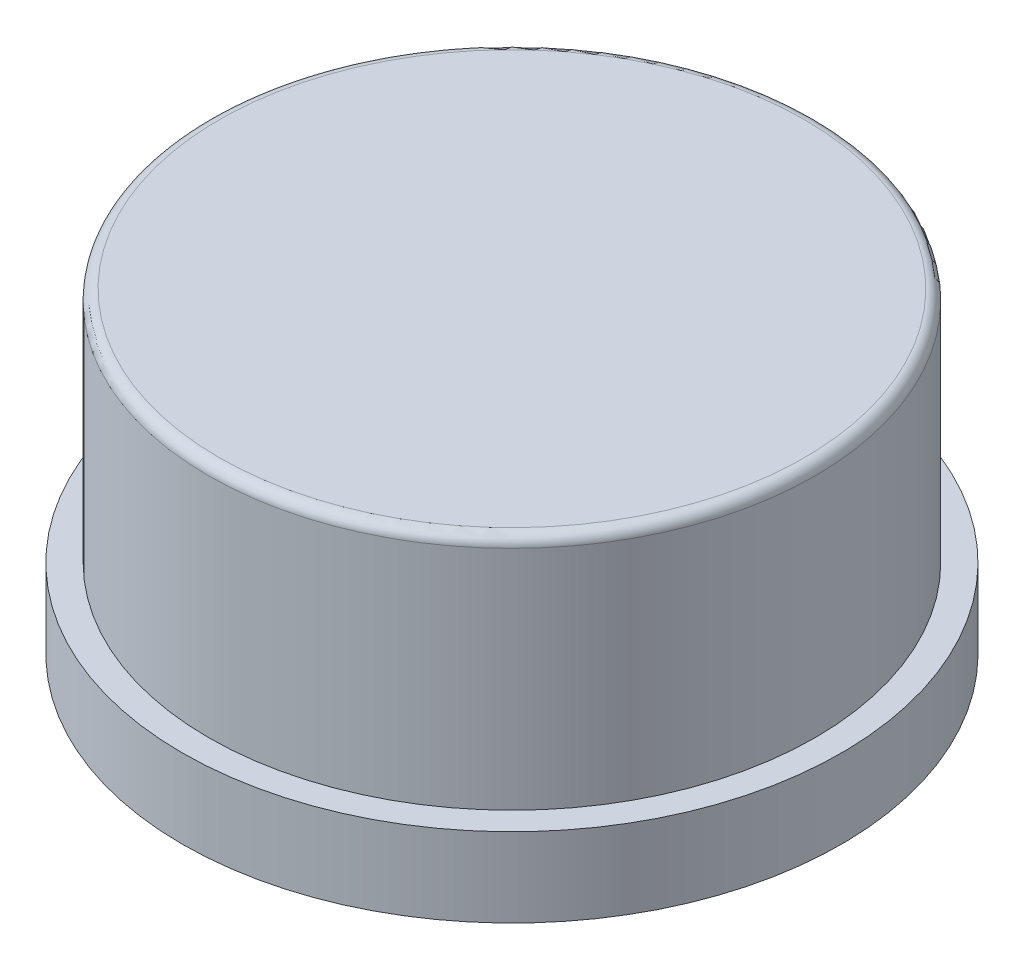
ISO-10303-21;
HEADER;
FILE_DESCRIPTION(('STEP AP214'),'2;1');
FILE_NAME('part.step','',(''),(''),'','','');
FILE_SCHEMA(('AUTOMOTIVE_DESIGN { 1 0 10303 214 1 1 1 1 }'));
ENDSEC;
DATA;
#1=APPLICATION_CONTEXT('core data for automotive mechanical design processes');
#2=APPLICATION_PROTOCOL_DEFINITION('international standard','automotive_design',2000,#1);
#3=PRODUCT_CONTEXT('',#1,'mechanical');
#4=PRODUCT('Part','Part','',(#3));
#5=PRODUCT_RELATED_PRODUCT_CATEGORY('part','',(#4));
#6=PRODUCT_DEFINITION_FORMATION('','',#4);
#7=PRODUCT_DEFINITION_CONTEXT('part definition',#1,'design');
#8=PRODUCT_DEFINITION('design','',#6,#7);
#9=PRODUCT_DEFINITION_SHAPE('','',#8);
#10=(LENGTH_UNIT() NAMED_UNIT(*) SI_UNIT(.MILLI.,.METRE.));
#11=(NAMED_UNIT(*) PLANE_ANGLE_UNIT() SI_UNIT($,.RADIAN.));
#12=(NAMED_UNIT(*) SI_UNIT($,.STERADIAN.) SOLID_ANGLE_UNIT());
#13=UNCERTAINTY_MEASURE_WITH_UNIT(LENGTH_MEASURE(1.E-05),#10,'distance_accuracy_value','');
#14=(GEOMETRIC_REPRESENTATION_CONTEXT(3) GLOBAL_UNCERTAINTY_ASSIGNED_CONTEXT((#13)) GLOBAL_UNIT_ASSIGNED_CONTEXT((#10,
#11,#12)) REPRESENTATION_CONTEXT('',''));
#15=CARTESIAN_POINT('',(0.,0.,0.));
#16=DIRECTION('',(0.,0.,1.));
#17=DIRECTION('',(1.,0.,0.));
#18=AXIS2_PLACEMENT_3D('',#15,#16,#17);
#19=CARTESIAN_POINT('',(0.,0.,0.));
#20=DIRECTION('',(0.,1.,0.));
#21=DIRECTION('',(0.,0.,1.));
#22=AXIS2_PLACEMENT_3D('',#19,#20,#21);
#23=PLANE('',#22);
#24=CARTESIAN_POINT('',(0.,0.,0.));
#25=DIRECTION('',(0.,1.,0.));
#26=DIRECTION('',(0.,0.,1.));
#27=AXIS2_PLACEMENT_3D('',#24,#25,#26);
#28=CIRCLE('',#27,6.25);
#29=CARTESIAN_POINT('',(0.,0.,6.25));
#30=VERTEX_POINT('',#29);
#31=EDGE_CURVE('E181',#30,#30,#28,.T.);
#32=ORIENTED_EDGE('',*,*,#31,.F.);
#33=EDGE_LOOP('',(#32));
#34=FACE_BOUND('',#33,.T.);
#35=DIRECTION('',(0.,0.,1.));
#36=VECTOR('',#35,1.);
#37=CARTESIAN_POINT('',(2.5,0.,-2.5));
#38=LINE('',#37,#36);
#39=CARTESIAN_POINT('',(2.5,0.,-2.5));
#40=VERTEX_POINT('',#39);
#41=CARTESIAN_POINT('',(2.5,0.,2.5));
#42=VERTEX_POINT('',#41);
#43=EDGE_CURVE('E142',#40,#42,#38,.T.);
#44=ORIENTED_EDGE('',*,*,#43,.F.);
#45=DIRECTION('',(-1.,0.,0.));
#46=VECTOR('',#45,1.);
#47=CARTESIAN_POINT('',(2.5,0.,-2.5));
#48=LINE('',#47,#46);
#49=CARTESIAN_POINT('',(-2.5,0.,-2.5));
#50=VERTEX_POINT('',#49);
#51=EDGE_CURVE('E154',#40,#50,#48,.T.);
#52=ORIENTED_EDGE('',*,*,#51,.T.);
#53=DIRECTION('',(0.,0.,1.));
#54=VECTOR('',#53,1.);
#55=CARTESIAN_POINT('',(-2.5,0.,-2.5));
#56=LINE('',#55,#54);
#57=CARTESIAN_POINT('',(-2.5,0.,2.5));
#58=VERTEX_POINT('',#57);
#59=EDGE_CURVE('E59',#50,#58,#56,.T.);
#60=ORIENTED_EDGE('',*,*,#59,.T.);
#61=DIRECTION('',(-1.,0.,0.));
#62=VECTOR('',#61,1.);
#63=CARTESIAN_POINT('',(2.5,0.,2.5));
#64=LINE('',#63,#62);
#65=EDGE_CURVE('E165',#42,#58,#64,.T.);
#66=ORIENTED_EDGE('',*,*,#65,.F.);
#67=EDGE_LOOP('',(#44,#52,#60,#66));
#68=FACE_BOUND('',#67,.T.);
#69=ADVANCED_FACE('F36',(#34,#68),#23,.F.);
#70=CARTESIAN_POINT('',(0.,1.5,0.));
#71=DIRECTION('',(0.,-1.,0.));
#72=DIRECTION('',(0.,0.,-1.));
#73=AXIS2_PLACEMENT_3D('',#70,#71,#72);
#74=CYLINDRICAL_SURFACE('',#73,6.25);
#75=CARTESIAN_POINT('',(0.,1.5,0.));
#76=DIRECTION('',(0.,1.,0.));
#77=DIRECTION('',(0.,0.,1.));
#78=AXIS2_PLACEMENT_3D('',#75,#76,#77);
#79=CIRCLE('',#78,6.25);
#80=CARTESIAN_POINT('',(0.,1.5,6.25));
#81=VERTEX_POINT('',#80);
#82=EDGE_CURVE('E182',#81,#81,#79,.T.);
#83=ORIENTED_EDGE('',*,*,#82,.F.);
#84=EDGE_LOOP('',(#83));
#85=FACE_BOUND('',#84,.T.);
#86=ORIENTED_EDGE('',*,*,#31,.T.);
#87=EDGE_LOOP('',(#86));
#88=FACE_BOUND('',#87,.T.);
#89=ADVANCED_FACE('F205',(#85,#88),#74,.T.);
#90=CARTESIAN_POINT('',(0.,1.5,0.));
#91=DIRECTION('',(0.,1.,0.));
#92=DIRECTION('',(0.,0.,1.));
#93=AXIS2_PLACEMENT_3D('',#90,#91,#92);
#94=PLANE('',#93);
#95=CARTESIAN_POINT('',(0.,1.5,0.));
#96=DIRECTION('',(0.,1.,0.));
#97=DIRECTION('',(0.,0.,1.));
#98=AXIS2_PLACEMENT_3D('',#95,#96,#97);
#99=CIRCLE('',#98,5.75);
#100=CARTESIAN_POINT('',(0.,1.5,5.75));
#101=VERTEX_POINT('',#100);
#102=EDGE_CURVE('E178',#101,#101,#99,.T.);
#103=ORIENTED_EDGE('',*,*,#102,.F.);
#104=EDGE_LOOP('',(#103));
#105=FACE_BOUND('',#104,.T.);
#106=ORIENTED_EDGE('',*,*,#82,.T.);
#107=EDGE_LOOP('',(#106));
#108=FACE_BOUND('',#107,.T.);
#109=ADVANCED_FACE('F211',(#105,#108),#94,.T.);
#110=CARTESIAN_POINT('',(0.,6.,0.));
#111=DIRECTION('',(0.,-1.,0.));
#112=DIRECTION('',(0.,0.,-1.));
#113=AXIS2_PLACEMENT_3D('',#110,#111,#112);
#114=CYLINDRICAL_SURFACE('',#113,5.75);
#115=CARTESIAN_POINT('',(0.,5.8,0.));
#116=DIRECTION('',(0.,1.,0.));
#117=DIRECTION('',(0.,0.,1.));
#118=AXIS2_PLACEMENT_3D('',#115,#116,#117);
#119=CIRCLE('',#118,5.75);
#120=CARTESIAN_POINT('',(0.,5.8,5.75));
#121=VERTEX_POINT('',#120);
#122=EDGE_CURVE('E11',#121,#121,#119,.F.);
#123=ORIENTED_EDGE('',*,*,#122,.T.);
#124=EDGE_LOOP('',(#123));
#125=FACE_BOUND('',#124,.T.);
#126=ORIENTED_EDGE('',*,*,#102,.T.);
#127=EDGE_LOOP('',(#126));
#128=FACE_BOUND('',#127,.T.);
#129=ADVANCED_FACE('F201',(#125,#128),#114,.T.);
#130=CARTESIAN_POINT('',(0.,6.,0.));
#131=DIRECTION('',(0.,1.,0.));
#132=DIRECTION('',(0.,0.,1.));
#133=AXIS2_PLACEMENT_3D('',#130,#131,#132);
#134=PLANE('',#133);
#135=CARTESIAN_POINT('',(0.,6.,0.));
#136=DIRECTION('',(0.,1.,0.));
#137=DIRECTION('',(0.,0.,1.));
#138=AXIS2_PLACEMENT_3D('',#135,#136,#137);
#139=CIRCLE('',#138,5.55);
#140=CARTESIAN_POINT('',(0.,6.,5.55));
#141=VERTEX_POINT('',#140);
#142=EDGE_CURVE('E44',#141,#141,#139,.T.);
#143=ORIENTED_EDGE('',*,*,#142,.T.);
#144=EDGE_LOOP('',(#143));
#145=FACE_BOUND('',#144,.T.);
#146=ADVANCED_FACE('F189',(#145),#134,.T.);
#147=CARTESIAN_POINT('',(0.,5.8,0.));
#148=DIRECTION('',(0.,1.,0.));
#149=DIRECTION('',(0.,0.,1.));
#150=AXIS2_PLACEMENT_3D('',#147,#148,#149);
#151=TOROIDAL_SURFACE('',#150,5.55,0.2);
#152=ORIENTED_EDGE('',*,*,#122,.F.);
#153=EDGE_LOOP('',(#152));
#154=FACE_BOUND('',#153,.T.);
#155=ORIENTED_EDGE('',*,*,#142,.F.);
#156=EDGE_LOOP('',(#155));
#157=FACE_BOUND('',#156,.T.);
#158=ADVANCED_FACE('F38',(#154,#157),#151,.T.);
#159=CARTESIAN_POINT('',(2.5,-0.1,-2.5));
#160=DIRECTION('',(-1.,0.,0.));
#161=DIRECTION('',(0.,0.,1.));
#162=AXIS2_PLACEMENT_3D('',#159,#160,#161);
#163=PLANE('',#162);
#164=ORIENTED_EDGE('',*,*,#43,.T.);
#165=DIRECTION('',(0.,1.,0.));
#166=VECTOR('',#165,1.);
#167=CARTESIAN_POINT('',(2.5,-0.1,2.5));
#168=LINE('',#167,#166);
#169=CARTESIAN_POINT('',(2.5,-0.1,2.5));
#170=VERTEX_POINT('',#169);
#171=EDGE_CURVE('E176',#170,#42,#168,.T.);
#172=ORIENTED_EDGE('',*,*,#171,.F.);
#173=DIRECTION('',(0.,0.,1.));
#174=VECTOR('',#173,1.);
#175=CARTESIAN_POINT('',(2.5,-0.1,-2.5));
#176=LINE('',#175,#174);
#177=CARTESIAN_POINT('',(2.5,-0.1,-2.5));
#178=VERTEX_POINT('',#177);
#179=EDGE_CURVE('E150',#178,#170,#176,.T.);
#180=ORIENTED_EDGE('',*,*,#179,.F.);
#181=DIRECTION('',(0.,1.,0.));
#182=VECTOR('',#181,1.);
#183=CARTESIAN_POINT('',(2.5,-0.1,-2.5));
#184=LINE('',#183,#182);
#185=EDGE_CURVE('E162',#178,#40,#184,.T.);
#186=ORIENTED_EDGE('',*,*,#185,.T.);
#187=EDGE_LOOP('',(#164,#172,#180,#186));
#188=FACE_BOUND('',#187,.T.);
#189=ADVANCED_FACE('F192',(#188),#163,.F.);
#190=CARTESIAN_POINT('',(2.5,-0.1,2.5));
#191=DIRECTION('',(0.,0.,-1.));
#192=DIRECTION('',(-1.,0.,0.));
#193=AXIS2_PLACEMENT_3D('',#190,#191,#192);
#194=PLANE('',#193);
#195=ORIENTED_EDGE('',*,*,#65,.T.);
#196=DIRECTION('',(0.,1.,0.));
#197=VECTOR('',#196,1.);
#198=CARTESIAN_POINT('',(-2.5,-0.1,2.5));
#199=LINE('',#198,#197);
#200=CARTESIAN_POINT('',(-2.5,-0.1,2.5));
#201=VERTEX_POINT('',#200);
#202=EDGE_CURVE('E174',#201,#58,#199,.T.);
#203=ORIENTED_EDGE('',*,*,#202,.F.);
#204=DIRECTION('',(-1.,0.,0.));
#205=VECTOR('',#204,1.);
#206=CARTESIAN_POINT('',(2.5,-0.1,2.5));
#207=LINE('',#206,#205);
#208=EDGE_CURVE('E153',#170,#201,#207,.T.);
#209=ORIENTED_EDGE('',*,*,#208,.F.);
#210=ORIENTED_EDGE('',*,*,#171,.T.);
#211=EDGE_LOOP('',(#195,#203,#209,#210));
#212=FACE_BOUND('',#211,.T.);
#213=ADVANCED_FACE('F198',(#212),#194,.F.);
#214=CARTESIAN_POINT('',(-2.5,-0.1,-2.5));
#215=DIRECTION('',(-1.,0.,0.));
#216=DIRECTION('',(0.,0.,1.));
#217=AXIS2_PLACEMENT_3D('',#214,#215,#216);
#218=PLANE('',#217);
#219=ORIENTED_EDGE('',*,*,#59,.F.);
#220=DIRECTION('',(0.,1.,0.));
#221=VECTOR('',#220,1.);
#222=CARTESIAN_POINT('',(-2.5,-0.1,-2.5));
#223=LINE('',#222,#221);
#224=CARTESIAN_POINT('',(-2.5,-0.1,-2.5));
#225=VERTEX_POINT('',#224);
#226=EDGE_CURVE('E172',#225,#50,#223,.T.);
#227=ORIENTED_EDGE('',*,*,#226,.F.);
#228=DIRECTION('',(0.,0.,1.));
#229=VECTOR('',#228,1.);
#230=CARTESIAN_POINT('',(-2.5,-0.1,-2.5));
#231=LINE('',#230,#229);
#232=EDGE_CURVE('E156',#225,#201,#231,.T.);
#233=ORIENTED_EDGE('',*,*,#232,.T.);
#234=ORIENTED_EDGE('',*,*,#202,.T.);
#235=EDGE_LOOP('',(#219,#227,#233,#234));
#236=FACE_BOUND('',#235,.T.);
#237=ADVANCED_FACE('F224',(#236),#218,.T.);
#238=CARTESIAN_POINT('',(2.5,-0.1,-2.5));
#239=DIRECTION('',(0.,0.,-1.));
#240=DIRECTION('',(-1.,0.,0.));
#241=AXIS2_PLACEMENT_3D('',#238,#239,#240);
#242=PLANE('',#241);
#243=ORIENTED_EDGE('',*,*,#51,.F.);
#244=ORIENTED_EDGE('',*,*,#185,.F.);
#245=DIRECTION('',(-1.,0.,0.));
#246=VECTOR('',#245,1.);
#247=CARTESIAN_POINT('',(2.5,-0.1,-2.5));
#248=LINE('',#247,#246);
#249=EDGE_CURVE('E159',#178,#225,#248,.T.);
#250=ORIENTED_EDGE('',*,*,#249,.T.);
#251=ORIENTED_EDGE('',*,*,#226,.T.);
#252=EDGE_LOOP('',(#243,#244,#250,#251));
#253=FACE_BOUND('',#252,.T.);
#254=ADVANCED_FACE('F228',(#253),#242,.T.);
#255=CARTESIAN_POINT('',(0.,-0.1,0.));
#256=DIRECTION('',(0.,-1.,0.));
#257=DIRECTION('',(0.,0.,-1.));
#258=AXIS2_PLACEMENT_3D('',#255,#256,#257);
#259=PLANE('',#258);
#260=DIRECTION('',(0.,0.,1.));
#261=VECTOR('',#260,1.);
#262=CARTESIAN_POINT('',(1.9,-0.1,-2.5));
#263=LINE('',#262,#261);
#264=CARTESIAN_POINT('',(1.9,-0.1,-1.9));
#265=VERTEX_POINT('',#264);
#266=CARTESIAN_POINT('',(1.9,-0.1,1.9));
#267=VERTEX_POINT('',#266);
#268=EDGE_CURVE('E122',#265,#267,#263,.T.);
#269=ORIENTED_EDGE('',*,*,#268,.F.);
#270=DIRECTION('',(-1.,0.,0.));
#271=VECTOR('',#270,1.);
#272=CARTESIAN_POINT('',(2.5,-0.1,-1.9));
#273=LINE('',#272,#271);
#274=CARTESIAN_POINT('',(-1.9,-0.1,-1.9));
#275=VERTEX_POINT('',#274);
#276=EDGE_CURVE('E145',#265,#275,#273,.T.);
#277=ORIENTED_EDGE('',*,*,#276,.T.);
#278=DIRECTION('',(0.,0.,1.));
#279=VECTOR('',#278,1.);
#280=CARTESIAN_POINT('',(-1.9,-0.1,-2.5));
#281=LINE('',#280,#279);
#282=CARTESIAN_POINT('',(-1.9,-0.1,1.9));
#283=VERTEX_POINT('',#282);
#284=EDGE_CURVE('E51',#275,#283,#281,.T.);
#285=ORIENTED_EDGE('',*,*,#284,.T.);
#286=DIRECTION('',(-1.,0.,0.));
#287=VECTOR('',#286,1.);
#288=CARTESIAN_POINT('',(2.5,-0.1,1.9));
#289=LINE('',#288,#287);
#290=EDGE_CURVE('E124',#267,#283,#289,.T.);
#291=ORIENTED_EDGE('',*,*,#290,.F.);
#292=EDGE_LOOP('',(#269,#277,#285,#291));
#293=FACE_BOUND('',#292,.T.);
#294=ORIENTED_EDGE('',*,*,#179,.T.);
#295=ORIENTED_EDGE('',*,*,#208,.T.);
#296=ORIENTED_EDGE('',*,*,#232,.F.);
#297=ORIENTED_EDGE('',*,*,#249,.F.);
#298=EDGE_LOOP('',(#294,#295,#296,#297));
#299=FACE_BOUND('',#298,.T.);
#300=ADVANCED_FACE('F231',(#293,#299),#259,.T.);
#301=CARTESIAN_POINT('',(0.,0.6,0.));
#302=DIRECTION('',(0.,1.,0.));
#303=DIRECTION('',(0.,0.,1.));
#304=AXIS2_PLACEMENT_3D('',#301,#302,#303);
#305=PLANE('',#304);
#306=CARTESIAN_POINT('',(0.,0.6,0.));
#307=DIRECTION('',(0.,1.,0.));
#308=DIRECTION('',(0.,0.,1.));
#309=AXIS2_PLACEMENT_3D('',#306,#307,#308);
#310=CIRCLE('',#309,5.65);
#311=CARTESIAN_POINT('',(0.,0.6,5.65));
#312=VERTEX_POINT('',#311);
#313=EDGE_CURVE('E135',#312,#312,#310,.T.);
#314=ORIENTED_EDGE('',*,*,#313,.T.);
#315=EDGE_LOOP('',(#314));
#316=FACE_BOUND('',#315,.T.);
#317=DIRECTION('',(0.,0.,1.));
#318=VECTOR('',#317,1.);
#319=CARTESIAN_POINT('',(1.9,0.6,0.));
#320=LINE('',#319,#318);
#321=CARTESIAN_POINT('',(1.9,0.6,-1.9));
#322=VERTEX_POINT('',#321);
#323=CARTESIAN_POINT('',(1.9,0.6,1.9));
#324=VERTEX_POINT('',#323);
#325=EDGE_CURVE('E127',#322,#324,#320,.T.);
#326=ORIENTED_EDGE('',*,*,#325,.T.);
#327=DIRECTION('',(-1.,0.,0.));
#328=VECTOR('',#327,1.);
#329=CARTESIAN_POINT('',(0.,0.6,1.9));
#330=LINE('',#329,#328);
#331=CARTESIAN_POINT('',(-1.9,0.6,1.9));
#332=VERTEX_POINT('',#331);
#333=EDGE_CURVE('E111',#324,#332,#330,.T.);
#334=ORIENTED_EDGE('',*,*,#333,.T.);
#335=DIRECTION('',(0.,0.,1.));
#336=VECTOR('',#335,1.);
#337=CARTESIAN_POINT('',(-1.9,0.6,0.));
#338=LINE('',#337,#336);
#339=CARTESIAN_POINT('',(-1.9,0.6,-1.9));
#340=VERTEX_POINT('',#339);
#341=EDGE_CURVE('E104',#340,#332,#338,.T.);
#342=ORIENTED_EDGE('',*,*,#341,.F.);
#343=DIRECTION('',(-1.,0.,0.));
#344=VECTOR('',#343,1.);
#345=CARTESIAN_POINT('',(0.,0.6,-1.9));
#346=LINE('',#345,#344);
#347=EDGE_CURVE('E108',#322,#340,#346,.T.);
#348=ORIENTED_EDGE('',*,*,#347,.F.);
#349=EDGE_LOOP('',(#326,#334,#342,#348));
#350=FACE_BOUND('',#349,.T.);
#351=ADVANCED_FACE('F106',(#316,#350),#305,.T.);
#352=CARTESIAN_POINT('',(0.,1.5,0.));
#353=DIRECTION('',(0.,-1.,0.));
#354=DIRECTION('',(0.,0.,-1.));
#355=AXIS2_PLACEMENT_3D('',#352,#353,#354);
#356=CYLINDRICAL_SURFACE('',#355,5.65);
#357=CARTESIAN_POINT('',(0.,0.9,0.));
#358=DIRECTION('',(0.,1.,0.));
#359=DIRECTION('',(0.,0.,1.));
#360=AXIS2_PLACEMENT_3D('',#357,#358,#359);
#361=CIRCLE('',#360,5.65);
#362=CARTESIAN_POINT('',(0.,0.9,5.65));
#363=VERTEX_POINT('',#362);
#364=EDGE_CURVE('E131',#363,#363,#361,.T.);
#365=ORIENTED_EDGE('',*,*,#364,.T.);
#366=EDGE_LOOP('',(#365));
#367=FACE_BOUND('',#366,.T.);
#368=ORIENTED_EDGE('',*,*,#313,.F.);
#369=EDGE_LOOP('',(#368));
#370=FACE_BOUND('',#369,.T.);
#371=ADVANCED_FACE('F259',(#367,#370),#356,.F.);
#372=CARTESIAN_POINT('',(0.,0.9,0.));
#373=DIRECTION('',(0.,1.,0.));
#374=DIRECTION('',(0.,0.,1.));
#375=AXIS2_PLACEMENT_3D('',#372,#373,#374);
#376=PLANE('',#375);
#377=CARTESIAN_POINT('',(0.,0.9,0.));
#378=DIRECTION('',(0.,1.,0.));
#379=DIRECTION('',(0.,0.,1.));
#380=AXIS2_PLACEMENT_3D('',#377,#378,#379);
#381=CIRCLE('',#380,5.15);
#382=CARTESIAN_POINT('',(0.,0.9,5.15));
#383=VERTEX_POINT('',#382);
#384=EDGE_CURVE('E136',#383,#383,#381,.T.);
#385=ORIENTED_EDGE('',*,*,#384,.T.);
#386=EDGE_LOOP('',(#385));
#387=FACE_BOUND('',#386,.T.);
#388=ORIENTED_EDGE('',*,*,#364,.F.);
#389=EDGE_LOOP('',(#388));
#390=FACE_BOUND('',#389,.T.);
#391=ADVANCED_FACE('F255',(#387,#390),#376,.F.);
#392=CARTESIAN_POINT('',(0.,6.,0.));
#393=DIRECTION('',(0.,-1.,0.));
#394=DIRECTION('',(0.,0.,-1.));
#395=AXIS2_PLACEMENT_3D('',#392,#393,#394);
#396=CYLINDRICAL_SURFACE('',#395,5.15);
#397=CARTESIAN_POINT('',(0.,5.4,0.));
#398=DIRECTION('',(0.,1.,0.));
#399=DIRECTION('',(0.,0.,1.));
#400=AXIS2_PLACEMENT_3D('',#397,#398,#399);
#401=CIRCLE('',#400,5.15);
#402=CARTESIAN_POINT('',(0.,5.4,5.15));
#403=VERTEX_POINT('',#402);
#404=EDGE_CURVE('E134',#403,#403,#401,.T.);
#405=ORIENTED_EDGE('',*,*,#404,.T.);
#406=EDGE_LOOP('',(#405));
#407=FACE_BOUND('',#406,.T.);
#408=ORIENTED_EDGE('',*,*,#384,.F.);
#409=EDGE_LOOP('',(#408));
#410=FACE_BOUND('',#409,.T.);
#411=ADVANCED_FACE('F251',(#407,#410),#396,.F.);
#412=CARTESIAN_POINT('',(0.,5.4,0.));
#413=DIRECTION('',(0.,1.,0.));
#414=DIRECTION('',(0.,0.,1.));
#415=AXIS2_PLACEMENT_3D('',#412,#413,#414);
#416=PLANE('',#415);
#417=ORIENTED_EDGE('',*,*,#404,.F.);
#418=EDGE_LOOP('',(#417));
#419=FACE_BOUND('',#418,.T.);
#420=ADVANCED_FACE('F247',(#419),#416,.F.);
#421=CARTESIAN_POINT('',(1.9,-0.1,-2.5));
#422=DIRECTION('',(-1.,0.,0.));
#423=DIRECTION('',(0.,0.,1.));
#424=AXIS2_PLACEMENT_3D('',#421,#422,#423);
#425=PLANE('',#424);
#426=ORIENTED_EDGE('',*,*,#325,.F.);
#427=DIRECTION('',(0.,1.,0.));
#428=VECTOR('',#427,1.);
#429=CARTESIAN_POINT('',(1.9,-0.1,-1.9));
#430=LINE('',#429,#428);
#431=EDGE_CURVE('E119',#265,#322,#430,.T.);
#432=ORIENTED_EDGE('',*,*,#431,.F.);
#433=ORIENTED_EDGE('',*,*,#268,.T.);
#434=DIRECTION('',(0.,1.,0.));
#435=VECTOR('',#434,1.);
#436=CARTESIAN_POINT('',(1.9,-0.1,1.9));
#437=LINE('',#436,#435);
#438=EDGE_CURVE('E139',#267,#324,#437,.T.);
#439=ORIENTED_EDGE('',*,*,#438,.T.);
#440=EDGE_LOOP('',(#426,#432,#433,#439));
#441=FACE_BOUND('',#440,.T.);
#442=ADVANCED_FACE('F243',(#441),#425,.T.);
#443=CARTESIAN_POINT('',(2.5,-0.1,1.9));
#444=DIRECTION('',(0.,0.,-1.));
#445=DIRECTION('',(-1.,0.,0.));
#446=AXIS2_PLACEMENT_3D('',#443,#444,#445);
#447=PLANE('',#446);
#448=ORIENTED_EDGE('',*,*,#333,.F.);
#449=ORIENTED_EDGE('',*,*,#438,.F.);
#450=ORIENTED_EDGE('',*,*,#290,.T.);
#451=DIRECTION('',(0.,1.,0.));
#452=VECTOR('',#451,1.);
#453=CARTESIAN_POINT('',(-1.9,-0.1,1.9));
#454=LINE('',#453,#452);
#455=EDGE_CURVE('E118',#283,#332,#454,.T.);
#456=ORIENTED_EDGE('',*,*,#455,.T.);
#457=EDGE_LOOP('',(#448,#449,#450,#456));
#458=FACE_BOUND('',#457,.T.);
#459=ADVANCED_FACE('F240',(#458),#447,.T.);
#460=CARTESIAN_POINT('',(-1.9,-0.1,-2.5));
#461=DIRECTION('',(-1.,0.,0.));
#462=DIRECTION('',(0.,0.,1.));
#463=AXIS2_PLACEMENT_3D('',#460,#461,#462);
#464=PLANE('',#463);
#465=ORIENTED_EDGE('',*,*,#341,.T.);
#466=ORIENTED_EDGE('',*,*,#455,.F.);
#467=ORIENTED_EDGE('',*,*,#284,.F.);
#468=DIRECTION('',(0.,1.,0.));
#469=VECTOR('',#468,1.);
#470=CARTESIAN_POINT('',(-1.9,-0.1,-1.9));
#471=LINE('',#470,#469);
#472=EDGE_CURVE('E113',#275,#340,#471,.T.);
#473=ORIENTED_EDGE('',*,*,#472,.T.);
#474=EDGE_LOOP('',(#465,#466,#467,#473));
#475=FACE_BOUND('',#474,.T.);
#476=ADVANCED_FACE('F114',(#475),#464,.F.);
#477=CARTESIAN_POINT('',(2.5,-0.1,-1.9));
#478=DIRECTION('',(0.,0.,-1.));
#479=DIRECTION('',(-1.,0.,0.));
#480=AXIS2_PLACEMENT_3D('',#477,#478,#479);
#481=PLANE('',#480);
#482=ORIENTED_EDGE('',*,*,#347,.T.);
#483=ORIENTED_EDGE('',*,*,#472,.F.);
#484=ORIENTED_EDGE('',*,*,#276,.F.);
#485=ORIENTED_EDGE('',*,*,#431,.T.);
#486=EDGE_LOOP('',(#482,#483,#484,#485));
#487=FACE_BOUND('',#486,.T.);
#488=ADVANCED_FACE('F121',(#487),#481,.F.);
#489=CLOSED_SHELL('',(#69,#89,#109,#129,#146,#158,#189,#213,#237,#254,#300,#351,#371,#391,#411,
#420,#442,#459,#476,#488));
#490=MANIFOLD_SOLID_BREP('B2',#489);
#491=ADVANCED_BREP_SHAPE_REPRESENTATION('',(#18,#490),#14);
#492=SHAPE_DEFINITION_REPRESENTATION(#9,#491);
ENDSEC;
END-ISO-10303-21;
